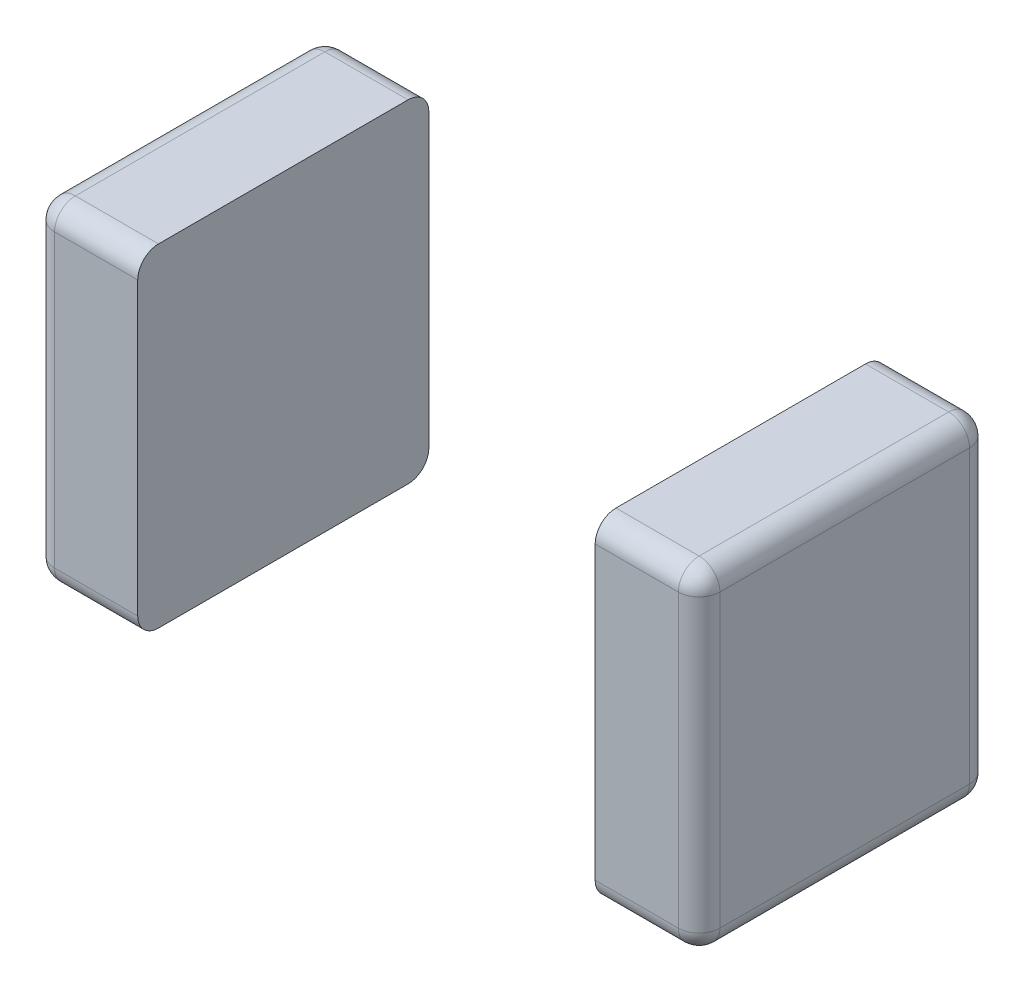
ISO-10303-21;
HEADER;
FILE_DESCRIPTION(('STEP AP214'),'2;1');
FILE_NAME('part.step','',(''),(''),'','','');
FILE_SCHEMA(('AUTOMOTIVE_DESIGN { 1 0 10303 214 1 1 1 1 }'));
ENDSEC;
DATA;
#1=APPLICATION_CONTEXT('core data for automotive mechanical design processes');
#2=APPLICATION_PROTOCOL_DEFINITION('international standard','automotive_design',2000,#1);
#3=PRODUCT_CONTEXT('',#1,'mechanical');
#4=PRODUCT('Part','Part','',(#3));
#5=PRODUCT_RELATED_PRODUCT_CATEGORY('part','',(#4));
#6=PRODUCT_DEFINITION_FORMATION('','',#4);
#7=PRODUCT_DEFINITION_CONTEXT('part definition',#1,'design');
#8=PRODUCT_DEFINITION('design','',#6,#7);
#9=PRODUCT_DEFINITION_SHAPE('','',#8);
#10=(LENGTH_UNIT() NAMED_UNIT(*) SI_UNIT(.MILLI.,.METRE.));
#11=(NAMED_UNIT(*) PLANE_ANGLE_UNIT() SI_UNIT($,.RADIAN.));
#12=(NAMED_UNIT(*) SI_UNIT($,.STERADIAN.) SOLID_ANGLE_UNIT());
#13=UNCERTAINTY_MEASURE_WITH_UNIT(LENGTH_MEASURE(1.E-05),#10,'distance_accuracy_value','');
#14=(GEOMETRIC_REPRESENTATION_CONTEXT(3) GLOBAL_UNCERTAINTY_ASSIGNED_CONTEXT((#13)) GLOBAL_UNIT_ASSIGNED_CONTEXT((#10,
#11,#12)) REPRESENTATION_CONTEXT('',''));
#15=CARTESIAN_POINT('',(0.,0.,0.));
#16=DIRECTION('',(0.,0.,1.));
#17=DIRECTION('',(1.,0.,0.));
#18=AXIS2_PLACEMENT_3D('',#15,#16,#17);
#19=CARTESIAN_POINT('',(1.6,-0.8,0.));
#20=DIRECTION('',(1.,0.,0.));
#21=DIRECTION('',(0.,1.,0.));
#22=AXIS2_PLACEMENT_3D('',#19,#20,#21);
#23=PLANE('',#22);
#24=DIRECTION('',(0.,1.,0.));
#25=VECTOR('',#24,1.);
#26=CARTESIAN_POINT('',(1.6,-0.4,1.3));
#27=LINE('',#26,#25);
#28=CARTESIAN_POINT('',(1.6,-0.7,1.3));
#29=VERTEX_POINT('',#28);
#30=CARTESIAN_POINT('',(1.6,0.7,1.3));
#31=VERTEX_POINT('',#30);
#32=EDGE_CURVE('P0_E204',#29,#31,#27,.T.);
#33=ORIENTED_EDGE('',*,*,#32,.F.);
#34=DIRECTION('',(0.,0.,1.));
#35=VECTOR('',#34,1.);
#36=CARTESIAN_POINT('',(1.6,-0.7,0.));
#37=LINE('',#36,#35);
#38=CARTESIAN_POINT('',(1.6,-0.7,0.1));
#39=VERTEX_POINT('',#38);
#40=EDGE_CURVE('P0_E27',#39,#29,#37,.T.);
#41=ORIENTED_EDGE('',*,*,#40,.F.);
#42=DIRECTION('',(0.,-1.,0.));
#43=VECTOR('',#42,1.);
#44=CARTESIAN_POINT('',(1.6,-0.4,0.1));
#45=LINE('',#44,#43);
#46=CARTESIAN_POINT('',(1.6,0.7,0.1));
#47=VERTEX_POINT('',#46);
#48=EDGE_CURVE('P0_E148',#47,#39,#45,.T.);
#49=ORIENTED_EDGE('',*,*,#48,.F.);
#50=DIRECTION('',(0.,0.,-1.));
#51=VECTOR('',#50,1.);
#52=CARTESIAN_POINT('',(1.6,0.7,0.));
#53=LINE('',#52,#51);
#54=EDGE_CURVE('P0_E166',#31,#47,#53,.T.);
#55=ORIENTED_EDGE('',*,*,#54,.F.);
#56=EDGE_LOOP('',(#33,#41,#49,#55));
#57=FACE_BOUND('',#56,.T.);
#58=ADVANCED_FACE('P0_F16',(#57),#23,.T.);
#59=CARTESIAN_POINT('',(1.5,-0.7,1.3));
#60=DIRECTION('',(-0.408248290463863,-0.816496580927726,-0.408248290463863));
#61=DIRECTION('',(0.577350269189626,-0.577350269189626,0.577350269189626));
#62=AXIS2_PLACEMENT_3D('',#59,#60,#61);
#63=SPHERICAL_SURFACE('',#62,0.1);
#64=CARTESIAN_POINT('',(1.5,-0.7,1.3));
#65=DIRECTION('',(0.,1.,0.));
#66=DIRECTION('',(0.,0.,1.));
#67=AXIS2_PLACEMENT_3D('',#64,#65,#66);
#68=CIRCLE('',#67,0.1);
#69=CARTESIAN_POINT('',(1.5,-0.7,1.4));
#70=VERTEX_POINT('',#69);
#71=EDGE_CURVE('P0_E209',#70,#29,#68,.T.);
#72=ORIENTED_EDGE('',*,*,#71,.F.);
#73=CARTESIAN_POINT('',(1.5,-0.7,1.3));
#74=DIRECTION('',(1.,0.,0.));
#75=DIRECTION('',(0.,-0.707106781186548,0.707106781186548));
#76=AXIS2_PLACEMENT_3D('',#73,#74,#75);
#77=CIRCLE('',#76,0.1);
#78=CARTESIAN_POINT('',(1.5,-0.8,1.3));
#79=VERTEX_POINT('',#78);
#80=EDGE_CURVE('P0_E158',#70,#79,#77,.T.);
#81=ORIENTED_EDGE('',*,*,#80,.T.);
#82=CARTESIAN_POINT('',(1.5,-0.7,1.3));
#83=DIRECTION('',(0.,0.,-1.));
#84=DIRECTION('',(1.,0.,0.));
#85=AXIS2_PLACEMENT_3D('',#82,#83,#84);
#86=CIRCLE('',#85,0.1);
#87=EDGE_CURVE('P0_E11',#29,#79,#86,.T.);
#88=ORIENTED_EDGE('',*,*,#87,.F.);
#89=EDGE_LOOP('',(#72,#81,#88));
#90=FACE_BOUND('',#89,.T.);
#91=ADVANCED_FACE('P0_F268',(#90),#63,.T.);
#92=CARTESIAN_POINT('',(1.5,-0.7,0.1));
#93=DIRECTION('',(-0.816496580927726,-0.408248290463863,-0.408248290463863));
#94=DIRECTION('',(0.577350269189626,-0.577350269189626,-0.577350269189626));
#95=AXIS2_PLACEMENT_3D('',#92,#93,#94);
#96=SPHERICAL_SURFACE('',#95,0.1);
#97=CARTESIAN_POINT('',(1.5,-0.7,0.1));
#98=DIRECTION('',(0.,0.,1.));
#99=DIRECTION('',(0.,-1.,0.));
#100=AXIS2_PLACEMENT_3D('',#97,#98,#99);
#101=CIRCLE('',#100,0.1);
#102=CARTESIAN_POINT('',(1.5,-0.8,0.1));
#103=VERTEX_POINT('',#102);
#104=EDGE_CURVE('P0_E152',#103,#39,#101,.T.);
#105=ORIENTED_EDGE('',*,*,#104,.F.);
#106=CARTESIAN_POINT('',(1.5,-0.7,0.1));
#107=DIRECTION('',(1.,0.,0.));
#108=DIRECTION('',(0.,-0.707106781186548,-0.707106781186548));
#109=AXIS2_PLACEMENT_3D('',#106,#107,#108);
#110=CIRCLE('',#109,0.1);
#111=CARTESIAN_POINT('',(1.5,-0.7,0.));
#112=VERTEX_POINT('',#111);
#113=EDGE_CURVE('P0_E143',#103,#112,#110,.T.);
#114=ORIENTED_EDGE('',*,*,#113,.T.);
#115=CARTESIAN_POINT('',(1.5,-0.7,0.1));
#116=DIRECTION('',(0.,1.,0.));
#117=DIRECTION('',(1.,0.,0.));
#118=AXIS2_PLACEMENT_3D('',#115,#116,#117);
#119=CIRCLE('',#118,0.1);
#120=EDGE_CURVE('P0_E168',#39,#112,#119,.T.);
#121=ORIENTED_EDGE('',*,*,#120,.F.);
#122=EDGE_LOOP('',(#105,#114,#121));
#123=FACE_BOUND('',#122,.T.);
#124=ADVANCED_FACE('P0_F327',(#123),#96,.T.);
#125=CARTESIAN_POINT('',(1.5,-0.7,0.));
#126=DIRECTION('',(0.,0.,1.));
#127=DIRECTION('',(0.707106781186548,-0.707106781186548,0.));
#128=AXIS2_PLACEMENT_3D('',#125,#126,#127);
#129=CYLINDRICAL_SURFACE('',#128,0.1);
#130=ORIENTED_EDGE('',*,*,#104,.T.);
#131=ORIENTED_EDGE('',*,*,#40,.T.);
#132=ORIENTED_EDGE('',*,*,#87,.T.);
#133=DIRECTION('',(0.,0.,-1.));
#134=VECTOR('',#133,1.);
#135=CARTESIAN_POINT('',(1.5,-0.8,0.));
#136=LINE('',#135,#134);
#137=EDGE_CURVE('P0_E196',#79,#103,#136,.T.);
#138=ORIENTED_EDGE('',*,*,#137,.T.);
#139=EDGE_LOOP('',(#130,#131,#132,#138));
#140=FACE_BOUND('',#139,.T.);
#141=ADVANCED_FACE('P0_F321',(#140),#129,.T.);
#142=CARTESIAN_POINT('',(1.5,0.7,0.1));
#143=DIRECTION('',(-0.816496580927726,0.408248290463863,-0.408248290463863));
#144=DIRECTION('',(0.577350269189626,0.577350269189626,-0.577350269189626));
#145=AXIS2_PLACEMENT_3D('',#142,#143,#144);
#146=SPHERICAL_SURFACE('',#145,0.1);
#147=CARTESIAN_POINT('',(1.5,0.7,0.1));
#148=DIRECTION('',(0.,-1.,0.));
#149=DIRECTION('',(0.,0.,-1.));
#150=AXIS2_PLACEMENT_3D('',#147,#148,#149);
#151=CIRCLE('',#150,0.1);
#152=CARTESIAN_POINT('',(1.5,0.7,0.));
#153=VERTEX_POINT('',#152);
#154=EDGE_CURVE('P0_E153',#153,#47,#151,.T.);
#155=ORIENTED_EDGE('',*,*,#154,.F.);
#156=CARTESIAN_POINT('',(1.5,0.7,0.1));
#157=DIRECTION('',(1.,0.,0.));
#158=DIRECTION('',(0.,0.707106781186548,-0.707106781186548));
#159=AXIS2_PLACEMENT_3D('',#156,#157,#158);
#160=CIRCLE('',#159,0.1);
#161=CARTESIAN_POINT('',(1.5,0.8,0.1));
#162=VERTEX_POINT('',#161);
#163=EDGE_CURVE('P0_E110',#153,#162,#160,.T.);
#164=ORIENTED_EDGE('',*,*,#163,.T.);
#165=CARTESIAN_POINT('',(1.5,0.7,0.1));
#166=DIRECTION('',(0.,0.,1.));
#167=DIRECTION('',(1.,0.,0.));
#168=AXIS2_PLACEMENT_3D('',#165,#166,#167);
#169=CIRCLE('',#168,0.1);
#170=EDGE_CURVE('P0_E167',#47,#162,#169,.T.);
#171=ORIENTED_EDGE('',*,*,#170,.F.);
#172=EDGE_LOOP('',(#155,#164,#171));
#173=FACE_BOUND('',#172,.T.);
#174=ADVANCED_FACE('P0_F326',(#173),#146,.T.);
#175=CARTESIAN_POINT('',(1.5,-0.4,0.1));
#176=DIRECTION('',(0.,1.,0.));
#177=DIRECTION('',(0.707106781186548,0.,-0.707106781186548));
#178=AXIS2_PLACEMENT_3D('',#175,#176,#177);
#179=CYLINDRICAL_SURFACE('',#178,0.1);
#180=ORIENTED_EDGE('',*,*,#120,.T.);
#181=DIRECTION('',(0.,1.,0.));
#182=VECTOR('',#181,1.);
#183=CARTESIAN_POINT('',(1.5,-0.4,0.));
#184=LINE('',#183,#182);
#185=EDGE_CURVE('P0_E147',#112,#153,#184,.T.);
#186=ORIENTED_EDGE('',*,*,#185,.T.);
#187=ORIENTED_EDGE('',*,*,#154,.T.);
#188=ORIENTED_EDGE('',*,*,#48,.T.);
#189=EDGE_LOOP('',(#180,#186,#187,#188));
#190=FACE_BOUND('',#189,.T.);
#191=ADVANCED_FACE('P0_F315',(#190),#179,.T.);
#192=CARTESIAN_POINT('',(1.5,0.7,1.3));
#193=DIRECTION('',(0.408248290463863,-0.816496580927726,0.408248290463863));
#194=DIRECTION('',(0.577350269189626,0.577350269189626,0.577350269189626));
#195=AXIS2_PLACEMENT_3D('',#192,#193,#194);
#196=SPHERICAL_SURFACE('',#195,0.1);
#197=CARTESIAN_POINT('',(1.5,0.7,1.3));
#198=DIRECTION('',(0.,0.,-1.));
#199=DIRECTION('',(0.,1.,0.));
#200=AXIS2_PLACEMENT_3D('',#197,#198,#199);
#201=CIRCLE('',#200,0.1);
#202=CARTESIAN_POINT('',(1.5,0.8,1.3));
#203=VERTEX_POINT('',#202);
#204=EDGE_CURVE('P0_E163',#203,#31,#201,.T.);
#205=ORIENTED_EDGE('',*,*,#204,.F.);
#206=CARTESIAN_POINT('',(1.5,0.7,1.3));
#207=DIRECTION('',(1.,0.,0.));
#208=DIRECTION('',(0.,0.707106781186548,0.707106781186548));
#209=AXIS2_PLACEMENT_3D('',#206,#207,#208);
#210=CIRCLE('',#209,0.1);
#211=CARTESIAN_POINT('',(1.5,0.7,1.4));
#212=VERTEX_POINT('',#211);
#213=EDGE_CURVE('P0_E142',#203,#212,#210,.T.);
#214=ORIENTED_EDGE('',*,*,#213,.T.);
#215=CARTESIAN_POINT('',(1.5,0.7,1.3));
#216=DIRECTION('',(0.,-1.,0.));
#217=DIRECTION('',(1.,0.,0.));
#218=AXIS2_PLACEMENT_3D('',#215,#216,#217);
#219=CIRCLE('',#218,0.1);
#220=EDGE_CURVE('P0_E208',#31,#212,#219,.T.);
#221=ORIENTED_EDGE('',*,*,#220,.F.);
#222=EDGE_LOOP('',(#205,#214,#221));
#223=FACE_BOUND('',#222,.T.);
#224=ADVANCED_FACE('P0_F296',(#223),#196,.T.);
#225=CARTESIAN_POINT('',(1.5,0.7,0.));
#226=DIRECTION('',(0.,0.,1.));
#227=DIRECTION('',(0.707106781186548,0.707106781186548,0.));
#228=AXIS2_PLACEMENT_3D('',#225,#226,#227);
#229=CYLINDRICAL_SURFACE('',#228,0.1);
#230=ORIENTED_EDGE('',*,*,#170,.T.);
#231=DIRECTION('',(0.,0.,1.));
#232=VECTOR('',#231,1.);
#233=CARTESIAN_POINT('',(1.5,0.8,0.));
#234=LINE('',#233,#232);
#235=EDGE_CURVE('P0_E192',#162,#203,#234,.T.);
#236=ORIENTED_EDGE('',*,*,#235,.T.);
#237=ORIENTED_EDGE('',*,*,#204,.T.);
#238=ORIENTED_EDGE('',*,*,#54,.T.);
#239=EDGE_LOOP('',(#230,#236,#237,#238));
#240=FACE_BOUND('',#239,.T.);
#241=ADVANCED_FACE('P0_F291',(#240),#229,.T.);
#242=CARTESIAN_POINT('',(1.5,-0.4,1.3));
#243=DIRECTION('',(0.,1.,0.));
#244=DIRECTION('',(0.707106781186548,0.,0.707106781186548));
#245=AXIS2_PLACEMENT_3D('',#242,#243,#244);
#246=CYLINDRICAL_SURFACE('',#245,0.1);
#247=ORIENTED_EDGE('',*,*,#71,.T.);
#248=ORIENTED_EDGE('',*,*,#32,.T.);
#249=ORIENTED_EDGE('',*,*,#220,.T.);
#250=DIRECTION('',(0.,-1.,0.));
#251=VECTOR('',#250,1.);
#252=CARTESIAN_POINT('',(1.5,-0.4,1.4));
#253=LINE('',#252,#251);
#254=EDGE_CURVE('P0_E159',#212,#70,#253,.T.);
#255=ORIENTED_EDGE('',*,*,#254,.T.);
#256=EDGE_LOOP('',(#247,#248,#249,#255));
#257=FACE_BOUND('',#256,.T.);
#258=ADVANCED_FACE('P0_F256',(#257),#246,.T.);
#259=CARTESIAN_POINT('',(0.,0.,0.));
#260=DIRECTION('',(0.,0.,1.));
#261=DIRECTION('',(1.,0.,0.));
#262=AXIS2_PLACEMENT_3D('',#259,#260,#261);
#263=PLANE('',#262);
#264=DIRECTION('',(0.,1.,0.));
#265=VECTOR('',#264,1.);
#266=CARTESIAN_POINT('',(1.1,-0.754575038837,0.));
#267=LINE('',#266,#265);
#268=CARTESIAN_POINT('',(1.1,-0.7,0.));
#269=VERTEX_POINT('',#268);
#270=CARTESIAN_POINT('',(1.1,0.7,0.));
#271=VERTEX_POINT('',#270);
#272=EDGE_CURVE('P0_E115',#269,#271,#267,.T.);
#273=ORIENTED_EDGE('',*,*,#272,.T.);
#274=DIRECTION('',(-1.,0.,0.));
#275=VECTOR('',#274,1.);
#276=CARTESIAN_POINT('',(0.8,0.7,0.));
#277=LINE('',#276,#275);
#278=EDGE_CURVE('P0_E103',#153,#271,#277,.T.);
#279=ORIENTED_EDGE('',*,*,#278,.F.);
#280=ORIENTED_EDGE('',*,*,#185,.F.);
#281=DIRECTION('',(1.,0.,0.));
#282=VECTOR('',#281,1.);
#283=CARTESIAN_POINT('',(-0.8,-0.7,0.));
#284=LINE('',#283,#282);
#285=EDGE_CURVE('P0_E91',#269,#112,#284,.T.);
#286=ORIENTED_EDGE('',*,*,#285,.F.);
#287=EDGE_LOOP('',(#273,#279,#280,#286));
#288=FACE_BOUND('',#287,.T.);
#289=ADVANCED_FACE('P0_F116',(#288),#263,.F.);
#290=CARTESIAN_POINT('',(-0.8,-0.7,0.1));
#291=DIRECTION('',(1.,0.,0.));
#292=DIRECTION('',(0.,-0.707106781186548,-0.707106781186548));
#293=AXIS2_PLACEMENT_3D('',#290,#291,#292);
#294=CYLINDRICAL_SURFACE('',#293,0.1);
#295=CARTESIAN_POINT('',(1.1,-0.7,0.1));
#296=DIRECTION('',(1.,0.,0.));
#297=DIRECTION('',(0.,-0.707106781186548,-0.707106781186548));
#298=AXIS2_PLACEMENT_3D('',#295,#296,#297);
#299=CIRCLE('',#298,0.1);
#300=CARTESIAN_POINT('',(1.1,-0.8,0.1));
#301=VERTEX_POINT('',#300);
#302=EDGE_CURVE('P0_E120',#301,#269,#299,.T.);
#303=ORIENTED_EDGE('',*,*,#302,.T.);
#304=ORIENTED_EDGE('',*,*,#285,.T.);
#305=ORIENTED_EDGE('',*,*,#113,.F.);
#306=DIRECTION('',(-1.,0.,0.));
#307=VECTOR('',#306,1.);
#308=CARTESIAN_POINT('',(-0.8,-0.8,0.1));
#309=LINE('',#308,#307);
#310=EDGE_CURVE('P0_E201',#103,#301,#309,.T.);
#311=ORIENTED_EDGE('',*,*,#310,.T.);
#312=EDGE_LOOP('',(#303,#304,#305,#311));
#313=FACE_BOUND('',#312,.T.);
#314=ADVANCED_FACE('P0_F337',(#313),#294,.T.);
#315=CARTESIAN_POINT('',(-1.6,-0.8,0.));
#316=DIRECTION('',(0.,-1.,0.));
#317=DIRECTION('',(0.,0.,-1.));
#318=AXIS2_PLACEMENT_3D('',#315,#316,#317);
#319=PLANE('',#318);
#320=DIRECTION('',(0.,0.,-1.));
#321=VECTOR('',#320,1.);
#322=CARTESIAN_POINT('',(1.1,-0.8,0.7));
#323=LINE('',#322,#321);
#324=CARTESIAN_POINT('',(1.1,-0.8,1.3));
#325=VERTEX_POINT('',#324);
#326=EDGE_CURVE('P0_E193',#325,#301,#323,.T.);
#327=ORIENTED_EDGE('',*,*,#326,.T.);
#328=ORIENTED_EDGE('',*,*,#310,.F.);
#329=ORIENTED_EDGE('',*,*,#137,.F.);
#330=DIRECTION('',(1.,0.,0.));
#331=VECTOR('',#330,1.);
#332=CARTESIAN_POINT('',(-0.8,-0.8,1.3));
#333=LINE('',#332,#331);
#334=EDGE_CURVE('P0_E154',#325,#79,#333,.T.);
#335=ORIENTED_EDGE('',*,*,#334,.F.);
#336=EDGE_LOOP('',(#327,#328,#329,#335));
#337=FACE_BOUND('',#336,.T.);
#338=ADVANCED_FACE('P0_F18',(#337),#319,.T.);
#339=CARTESIAN_POINT('',(-0.8,-0.7,1.3));
#340=DIRECTION('',(1.,0.,0.));
#341=DIRECTION('',(0.,-0.707106781186548,0.707106781186548));
#342=AXIS2_PLACEMENT_3D('',#339,#340,#341);
#343=CYLINDRICAL_SURFACE('',#342,0.1);
#344=CARTESIAN_POINT('',(1.1,-0.7,1.3));
#345=DIRECTION('',(1.,0.,0.));
#346=DIRECTION('',(0.,-0.707106781186548,0.707106781186548));
#347=AXIS2_PLACEMENT_3D('',#344,#345,#346);
#348=CIRCLE('',#347,0.1);
#349=CARTESIAN_POINT('',(1.1,-0.7,1.4));
#350=VERTEX_POINT('',#349);
#351=EDGE_CURVE('P0_E20',#350,#325,#348,.T.);
#352=ORIENTED_EDGE('',*,*,#351,.T.);
#353=ORIENTED_EDGE('',*,*,#334,.T.);
#354=ORIENTED_EDGE('',*,*,#80,.F.);
#355=DIRECTION('',(-1.,0.,0.));
#356=VECTOR('',#355,1.);
#357=CARTESIAN_POINT('',(-0.8,-0.7,1.4));
#358=LINE('',#357,#356);
#359=EDGE_CURVE('P0_E160',#70,#350,#358,.T.);
#360=ORIENTED_EDGE('',*,*,#359,.T.);
#361=EDGE_LOOP('',(#352,#353,#354,#360));
#362=FACE_BOUND('',#361,.T.);
#363=ADVANCED_FACE('P0_F265',(#362),#343,.T.);
#364=CARTESIAN_POINT('',(0.,0.,1.4));
#365=DIRECTION('',(0.,0.,1.));
#366=DIRECTION('',(1.,0.,0.));
#367=AXIS2_PLACEMENT_3D('',#364,#365,#366);
#368=PLANE('',#367);
#369=DIRECTION('',(0.,-1.,0.));
#370=VECTOR('',#369,1.);
#371=CARTESIAN_POINT('',(1.1,-0.754575038837,1.4));
#372=LINE('',#371,#370);
#373=CARTESIAN_POINT('',(1.1,0.7,1.4));
#374=VERTEX_POINT('',#373);
#375=EDGE_CURVE('P0_E137',#374,#350,#372,.T.);
#376=ORIENTED_EDGE('',*,*,#375,.T.);
#377=ORIENTED_EDGE('',*,*,#359,.F.);
#378=ORIENTED_EDGE('',*,*,#254,.F.);
#379=DIRECTION('',(1.,0.,0.));
#380=VECTOR('',#379,1.);
#381=CARTESIAN_POINT('',(0.8,0.7,1.4));
#382=LINE('',#381,#380);
#383=EDGE_CURVE('P0_E112',#374,#212,#382,.T.);
#384=ORIENTED_EDGE('',*,*,#383,.F.);
#385=EDGE_LOOP('',(#376,#377,#378,#384));
#386=FACE_BOUND('',#385,.T.);
#387=ADVANCED_FACE('P0_F260',(#386),#368,.T.);
#388=CARTESIAN_POINT('',(0.8,0.7,1.3));
#389=DIRECTION('',(-1.,0.,0.));
#390=DIRECTION('',(0.,0.707106781186548,0.707106781186548));
#391=AXIS2_PLACEMENT_3D('',#388,#389,#390);
#392=CYLINDRICAL_SURFACE('',#391,0.1);
#393=CARTESIAN_POINT('',(1.1,0.7,1.3));
#394=DIRECTION('',(1.,0.,0.));
#395=DIRECTION('',(0.,0.707106781186548,0.707106781186548));
#396=AXIS2_PLACEMENT_3D('',#393,#394,#395);
#397=CIRCLE('',#396,0.1);
#398=CARTESIAN_POINT('',(1.1,0.8,1.3));
#399=VERTEX_POINT('',#398);
#400=EDGE_CURVE('P0_E133',#399,#374,#397,.T.);
#401=ORIENTED_EDGE('',*,*,#400,.T.);
#402=ORIENTED_EDGE('',*,*,#383,.T.);
#403=ORIENTED_EDGE('',*,*,#213,.F.);
#404=DIRECTION('',(-1.,0.,0.));
#405=VECTOR('',#404,1.);
#406=CARTESIAN_POINT('',(0.8,0.8,1.3));
#407=LINE('',#406,#405);
#408=EDGE_CURVE('P0_E189',#203,#399,#407,.T.);
#409=ORIENTED_EDGE('',*,*,#408,.T.);
#410=EDGE_LOOP('',(#401,#402,#403,#409));
#411=FACE_BOUND('',#410,.T.);
#412=ADVANCED_FACE('P0_F298',(#411),#392,.T.);
#413=CARTESIAN_POINT('',(0.8,0.7,0.1));
#414=DIRECTION('',(-1.,0.,0.));
#415=DIRECTION('',(0.,0.707106781186548,-0.707106781186548));
#416=AXIS2_PLACEMENT_3D('',#413,#414,#415);
#417=CYLINDRICAL_SURFACE('',#416,0.1);
#418=CARTESIAN_POINT('',(1.1,0.7,0.1));
#419=DIRECTION('',(1.,0.,0.));
#420=DIRECTION('',(0.,0.707106781186548,-0.707106781186548));
#421=AXIS2_PLACEMENT_3D('',#418,#419,#420);
#422=CIRCLE('',#421,0.1);
#423=CARTESIAN_POINT('',(1.1,0.8,0.1));
#424=VERTEX_POINT('',#423);
#425=EDGE_CURVE('P0_E107',#271,#424,#422,.T.);
#426=ORIENTED_EDGE('',*,*,#425,.T.);
#427=DIRECTION('',(1.,0.,0.));
#428=VECTOR('',#427,1.);
#429=CARTESIAN_POINT('',(0.8,0.8,0.1));
#430=LINE('',#429,#428);
#431=EDGE_CURVE('P0_E200',#424,#162,#430,.T.);
#432=ORIENTED_EDGE('',*,*,#431,.T.);
#433=ORIENTED_EDGE('',*,*,#163,.F.);
#434=ORIENTED_EDGE('',*,*,#278,.T.);
#435=EDGE_LOOP('',(#426,#432,#433,#434));
#436=FACE_BOUND('',#435,.T.);
#437=ADVANCED_FACE('P0_F104',(#436),#417,.T.);
#438=CARTESIAN_POINT('',(1.6,0.8,0.));
#439=DIRECTION('',(0.,1.,0.));
#440=DIRECTION('',(1.,0.,0.));
#441=AXIS2_PLACEMENT_3D('',#438,#439,#440);
#442=PLANE('',#441);
#443=DIRECTION('',(0.,0.,1.));
#444=VECTOR('',#443,1.);
#445=CARTESIAN_POINT('',(1.1,0.8,0.7));
#446=LINE('',#445,#444);
#447=EDGE_CURVE('P0_E126',#424,#399,#446,.T.);
#448=ORIENTED_EDGE('',*,*,#447,.T.);
#449=ORIENTED_EDGE('',*,*,#408,.F.);
#450=ORIENTED_EDGE('',*,*,#235,.F.);
#451=ORIENTED_EDGE('',*,*,#431,.F.);
#452=EDGE_LOOP('',(#448,#449,#450,#451));
#453=FACE_BOUND('',#452,.T.);
#454=ADVANCED_FACE('P0_F390',(#453),#442,.T.);
#455=CARTESIAN_POINT('',(1.1,-1.509150077673,1.4));
#456=DIRECTION('',(1.,0.,0.));
#457=DIRECTION('',(0.,1.,0.));
#458=AXIS2_PLACEMENT_3D('',#455,#456,#457);
#459=PLANE('',#458);
#460=ORIENTED_EDGE('',*,*,#351,.F.);
#461=ORIENTED_EDGE('',*,*,#375,.F.);
#462=ORIENTED_EDGE('',*,*,#400,.F.);
#463=ORIENTED_EDGE('',*,*,#447,.F.);
#464=ORIENTED_EDGE('',*,*,#425,.F.);
#465=ORIENTED_EDGE('',*,*,#272,.F.);
#466=ORIENTED_EDGE('',*,*,#302,.F.);
#467=ORIENTED_EDGE('',*,*,#326,.F.);
#468=EDGE_LOOP('',(#460,#461,#462,#463,#464,#465,#466,#467));
#469=FACE_BOUND('',#468,.T.);
#470=ADVANCED_FACE('P0_F123',(#469),#459,.F.);
#471=CLOSED_SHELL('',(#58,#91,#124,#141,#174,#191,#224,#241,#258,#289,#314,#338,#363,#387,#412,
#437,#454,#470));
#472=MANIFOLD_SOLID_BREP('P0_B1',#471);
#473=CARTESIAN_POINT('',(-1.1,1.509150077673,1.4));
#474=DIRECTION('',(-1.,0.,0.));
#475=DIRECTION('',(0.,0.,1.));
#476=AXIS2_PLACEMENT_3D('',#473,#474,#475);
#477=PLANE('',#476);
#478=CARTESIAN_POINT('',(-1.1,-0.7,1.3));
#479=DIRECTION('',(-1.,0.,0.));
#480=DIRECTION('',(0.,-0.707106781186548,0.707106781186548));
#481=AXIS2_PLACEMENT_3D('',#478,#479,#480);
#482=CIRCLE('',#481,0.1);
#483=CARTESIAN_POINT('',(-1.1,-0.8,1.3));
#484=VERTEX_POINT('',#483);
#485=CARTESIAN_POINT('',(-1.1,-0.7,1.4));
#486=VERTEX_POINT('',#485);
#487=EDGE_CURVE('P1_E169',#484,#486,#482,.T.);
#488=ORIENTED_EDGE('',*,*,#487,.F.);
#489=DIRECTION('',(0.,0.,1.));
#490=VECTOR('',#489,1.);
#491=CARTESIAN_POINT('',(-1.1,-0.8,0.7));
#492=LINE('',#491,#490);
#493=CARTESIAN_POINT('',(-1.1,-0.8,0.1));
#494=VERTEX_POINT('',#493);
#495=EDGE_CURVE('P1_E173',#494,#484,#492,.T.);
#496=ORIENTED_EDGE('',*,*,#495,.F.);
#497=CARTESIAN_POINT('',(-1.1,-0.7,0.1));
#498=DIRECTION('',(-1.,0.,0.));
#499=DIRECTION('',(0.,-0.707106781186548,-0.707106781186548));
#500=AXIS2_PLACEMENT_3D('',#497,#498,#499);
#501=CIRCLE('',#500,0.1);
#502=CARTESIAN_POINT('',(-1.1,-0.7,0.));
#503=VERTEX_POINT('',#502);
#504=EDGE_CURVE('P1_E129',#503,#494,#501,.T.);
#505=ORIENTED_EDGE('',*,*,#504,.F.);
#506=DIRECTION('',(0.,-1.,0.));
#507=VECTOR('',#506,1.);
#508=CARTESIAN_POINT('',(-1.1,0.754575038837,0.));
#509=LINE('',#508,#507);
#510=CARTESIAN_POINT('',(-1.1,0.7,0.));
#511=VERTEX_POINT('',#510);
#512=EDGE_CURVE('P1_E115',#511,#503,#509,.T.);
#513=ORIENTED_EDGE('',*,*,#512,.F.);
#514=CARTESIAN_POINT('',(-1.1,0.7,0.1));
#515=DIRECTION('',(-1.,0.,0.));
#516=DIRECTION('',(0.,0.707106781186548,-0.707106781186548));
#517=AXIS2_PLACEMENT_3D('',#514,#515,#516);
#518=CIRCLE('',#517,0.1);
#519=CARTESIAN_POINT('',(-1.1,0.8,0.1));
#520=VERTEX_POINT('',#519);
#521=EDGE_CURVE('P1_E105',#520,#511,#518,.T.);
#522=ORIENTED_EDGE('',*,*,#521,.F.);
#523=DIRECTION('',(0.,0.,-1.));
#524=VECTOR('',#523,1.);
#525=CARTESIAN_POINT('',(-1.1,0.8,0.7));
#526=LINE('',#525,#524);
#527=CARTESIAN_POINT('',(-1.1,0.8,1.3));
#528=VERTEX_POINT('',#527);
#529=EDGE_CURVE('P1_E11',#528,#520,#526,.T.);
#530=ORIENTED_EDGE('',*,*,#529,.F.);
#531=CARTESIAN_POINT('',(-1.1,0.7,1.3));
#532=DIRECTION('',(-1.,0.,0.));
#533=DIRECTION('',(0.,0.707106781186548,0.707106781186548));
#534=AXIS2_PLACEMENT_3D('',#531,#532,#533);
#535=CIRCLE('',#534,0.1);
#536=CARTESIAN_POINT('',(-1.1,0.7,1.4));
#537=VERTEX_POINT('',#536);
#538=EDGE_CURVE('P1_E102',#537,#528,#535,.T.);
#539=ORIENTED_EDGE('',*,*,#538,.F.);
#540=DIRECTION('',(0.,1.,0.));
#541=VECTOR('',#540,1.);
#542=CARTESIAN_POINT('',(-1.1,0.754575038837,1.4));
#543=LINE('',#542,#541);
#544=EDGE_CURVE('P1_E194',#486,#537,#543,.T.);
#545=ORIENTED_EDGE('',*,*,#544,.F.);
#546=EDGE_LOOP('',(#488,#496,#505,#513,#522,#530,#539,#545));
#547=FACE_BOUND('',#546,.T.);
#548=ADVANCED_FACE('P1_F16',(#547),#477,.F.);
#549=CARTESIAN_POINT('',(1.6,0.8,0.));
#550=DIRECTION('',(0.,1.,0.));
#551=DIRECTION('',(1.,0.,0.));
#552=AXIS2_PLACEMENT_3D('',#549,#550,#551);
#553=PLANE('',#552);
#554=ORIENTED_EDGE('',*,*,#529,.T.);
#555=DIRECTION('',(1.,0.,0.));
#556=VECTOR('',#555,1.);
#557=CARTESIAN_POINT('',(0.8,0.8,0.1));
#558=LINE('',#557,#556);
#559=CARTESIAN_POINT('',(-1.5,0.8,0.1));
#560=VERTEX_POINT('',#559);
#561=EDGE_CURVE('P1_E27',#560,#520,#558,.T.);
#562=ORIENTED_EDGE('',*,*,#561,.F.);
#563=DIRECTION('',(0.,0.,-1.));
#564=VECTOR('',#563,1.);
#565=CARTESIAN_POINT('',(-1.5,0.8,0.));
#566=LINE('',#565,#564);
#567=CARTESIAN_POINT('',(-1.5,0.8,1.3));
#568=VERTEX_POINT('',#567);
#569=EDGE_CURVE('P1_E110',#568,#560,#566,.T.);
#570=ORIENTED_EDGE('',*,*,#569,.F.);
#571=DIRECTION('',(-1.,0.,0.));
#572=VECTOR('',#571,1.);
#573=CARTESIAN_POINT('',(0.8,0.8,1.3));
#574=LINE('',#573,#572);
#575=EDGE_CURVE('P1_E107',#528,#568,#574,.T.);
#576=ORIENTED_EDGE('',*,*,#575,.F.);
#577=EDGE_LOOP('',(#554,#562,#570,#576));
#578=FACE_BOUND('',#577,.T.);
#579=ADVANCED_FACE('P1_F108',(#578),#553,.T.);
#580=CARTESIAN_POINT('',(0.8,0.7,0.1));
#581=DIRECTION('',(-1.,0.,0.));
#582=DIRECTION('',(0.,0.707106781186548,-0.707106781186548));
#583=AXIS2_PLACEMENT_3D('',#580,#581,#582);
#584=CYLINDRICAL_SURFACE('',#583,0.1);
#585=ORIENTED_EDGE('',*,*,#521,.T.);
#586=DIRECTION('',(-1.,0.,0.));
#587=VECTOR('',#586,1.);
#588=CARTESIAN_POINT('',(0.8,0.7,0.));
#589=LINE('',#588,#587);
#590=CARTESIAN_POINT('',(-1.5,0.7,0.));
#591=VERTEX_POINT('',#590);
#592=EDGE_CURVE('P1_E158',#511,#591,#589,.T.);
#593=ORIENTED_EDGE('',*,*,#592,.T.);
#594=CARTESIAN_POINT('',(-1.5,0.7,0.1));
#595=DIRECTION('',(-1.,0.,0.));
#596=DIRECTION('',(0.,0.707106781186548,-0.707106781186548));
#597=AXIS2_PLACEMENT_3D('',#594,#595,#596);
#598=CIRCLE('',#597,0.1);
#599=EDGE_CURVE('P1_E156',#560,#591,#598,.T.);
#600=ORIENTED_EDGE('',*,*,#599,.F.);
#601=ORIENTED_EDGE('',*,*,#561,.T.);
#602=EDGE_LOOP('',(#585,#593,#600,#601));
#603=FACE_BOUND('',#602,.T.);
#604=ADVANCED_FACE('P1_F295',(#603),#584,.T.);
#605=CARTESIAN_POINT('',(0.,0.,0.));
#606=DIRECTION('',(0.,0.,1.));
#607=DIRECTION('',(1.,0.,0.));
#608=AXIS2_PLACEMENT_3D('',#605,#606,#607);
#609=PLANE('',#608);
#610=ORIENTED_EDGE('',*,*,#512,.T.);
#611=DIRECTION('',(1.,0.,0.));
#612=VECTOR('',#611,1.);
#613=CARTESIAN_POINT('',(-0.8,-0.7,0.));
#614=LINE('',#613,#612);
#615=CARTESIAN_POINT('',(-1.5,-0.7,0.));
#616=VERTEX_POINT('',#615);
#617=EDGE_CURVE('P1_E122',#616,#503,#614,.T.);
#618=ORIENTED_EDGE('',*,*,#617,.F.);
#619=DIRECTION('',(0.,-1.,0.));
#620=VECTOR('',#619,1.);
#621=CARTESIAN_POINT('',(-1.5,0.4,0.));
#622=LINE('',#621,#620);
#623=EDGE_CURVE('P1_E146',#591,#616,#622,.T.);
#624=ORIENTED_EDGE('',*,*,#623,.F.);
#625=ORIENTED_EDGE('',*,*,#592,.F.);
#626=EDGE_LOOP('',(#610,#618,#624,#625));
#627=FACE_BOUND('',#626,.T.);
#628=ADVANCED_FACE('P1_F291',(#627),#609,.F.);
#629=CARTESIAN_POINT('',(0.8,0.7,1.3));
#630=DIRECTION('',(-1.,0.,0.));
#631=DIRECTION('',(0.,0.707106781186548,0.707106781186548));
#632=AXIS2_PLACEMENT_3D('',#629,#630,#631);
#633=CYLINDRICAL_SURFACE('',#632,0.1);
#634=ORIENTED_EDGE('',*,*,#538,.T.);
#635=ORIENTED_EDGE('',*,*,#575,.T.);
#636=CARTESIAN_POINT('',(-1.5,0.7,1.3));
#637=DIRECTION('',(-1.,0.,0.));
#638=DIRECTION('',(0.,0.707106781186548,0.707106781186548));
#639=AXIS2_PLACEMENT_3D('',#636,#637,#638);
#640=CIRCLE('',#639,0.1);
#641=CARTESIAN_POINT('',(-1.5,0.7,1.4));
#642=VERTEX_POINT('',#641);
#643=EDGE_CURVE('P1_E132',#642,#568,#640,.T.);
#644=ORIENTED_EDGE('',*,*,#643,.F.);
#645=DIRECTION('',(1.,0.,0.));
#646=VECTOR('',#645,1.);
#647=CARTESIAN_POINT('',(0.8,0.7,1.4));
#648=LINE('',#647,#646);
#649=EDGE_CURVE('P1_E119',#642,#537,#648,.T.);
#650=ORIENTED_EDGE('',*,*,#649,.T.);
#651=EDGE_LOOP('',(#634,#635,#644,#650));
#652=FACE_BOUND('',#651,.T.);
#653=ADVANCED_FACE('P1_F117',(#652),#633,.T.);
#654=CARTESIAN_POINT('',(-0.8,-0.7,0.1));
#655=DIRECTION('',(1.,0.,0.));
#656=DIRECTION('',(0.,-0.707106781186548,-0.707106781186548));
#657=AXIS2_PLACEMENT_3D('',#654,#655,#656);
#658=CYLINDRICAL_SURFACE('',#657,0.1);
#659=ORIENTED_EDGE('',*,*,#504,.T.);
#660=DIRECTION('',(-1.,0.,0.));
#661=VECTOR('',#660,1.);
#662=CARTESIAN_POINT('',(-0.8,-0.8,0.1));
#663=LINE('',#662,#661);
#664=CARTESIAN_POINT('',(-1.5,-0.8,0.1));
#665=VERTEX_POINT('',#664);
#666=EDGE_CURVE('P1_E20',#494,#665,#663,.T.);
#667=ORIENTED_EDGE('',*,*,#666,.T.);
#668=CARTESIAN_POINT('',(-1.5,-0.7,0.1));
#669=DIRECTION('',(-1.,0.,0.));
#670=DIRECTION('',(0.,-0.707106781186548,-0.707106781186548));
#671=AXIS2_PLACEMENT_3D('',#668,#669,#670);
#672=CIRCLE('',#671,0.1);
#673=EDGE_CURVE('P1_E150',#616,#665,#672,.T.);
#674=ORIENTED_EDGE('',*,*,#673,.F.);
#675=ORIENTED_EDGE('',*,*,#617,.T.);
#676=EDGE_LOOP('',(#659,#667,#674,#675));
#677=FACE_BOUND('',#676,.T.);
#678=ADVANCED_FACE('P1_F265',(#677),#658,.T.);
#679=CARTESIAN_POINT('',(0.,0.,1.4));
#680=DIRECTION('',(0.,0.,1.));
#681=DIRECTION('',(1.,0.,0.));
#682=AXIS2_PLACEMENT_3D('',#679,#680,#681);
#683=PLANE('',#682);
#684=ORIENTED_EDGE('',*,*,#544,.T.);
#685=ORIENTED_EDGE('',*,*,#649,.F.);
#686=DIRECTION('',(0.,1.,0.));
#687=VECTOR('',#686,1.);
#688=CARTESIAN_POINT('',(-1.5,0.4,1.4));
#689=LINE('',#688,#687);
#690=CARTESIAN_POINT('',(-1.5,-0.7,1.4));
#691=VERTEX_POINT('',#690);
#692=EDGE_CURVE('P1_E170',#691,#642,#689,.T.);
#693=ORIENTED_EDGE('',*,*,#692,.F.);
#694=DIRECTION('',(-1.,0.,0.));
#695=VECTOR('',#694,1.);
#696=CARTESIAN_POINT('',(-0.8,-0.7,1.4));
#697=LINE('',#696,#695);
#698=EDGE_CURVE('P1_E203',#486,#691,#697,.T.);
#699=ORIENTED_EDGE('',*,*,#698,.F.);
#700=EDGE_LOOP('',(#684,#685,#693,#699));
#701=FACE_BOUND('',#700,.T.);
#702=ADVANCED_FACE('P1_F273',(#701),#683,.T.);
#703=CARTESIAN_POINT('',(-1.6,-0.8,0.));
#704=DIRECTION('',(0.,-1.,0.));
#705=DIRECTION('',(0.,0.,-1.));
#706=AXIS2_PLACEMENT_3D('',#703,#704,#705);
#707=PLANE('',#706);
#708=ORIENTED_EDGE('',*,*,#495,.T.);
#709=DIRECTION('',(1.,0.,0.));
#710=VECTOR('',#709,1.);
#711=CARTESIAN_POINT('',(-0.8,-0.8,1.3));
#712=LINE('',#711,#710);
#713=CARTESIAN_POINT('',(-1.5,-0.8,1.3));
#714=VERTEX_POINT('',#713);
#715=EDGE_CURVE('P1_E177',#714,#484,#712,.T.);
#716=ORIENTED_EDGE('',*,*,#715,.F.);
#717=DIRECTION('',(0.,0.,1.));
#718=VECTOR('',#717,1.);
#719=CARTESIAN_POINT('',(-1.5,-0.8,0.));
#720=LINE('',#719,#718);
#721=EDGE_CURVE('P1_E137',#665,#714,#720,.T.);
#722=ORIENTED_EDGE('',*,*,#721,.F.);
#723=ORIENTED_EDGE('',*,*,#666,.F.);
#724=EDGE_LOOP('',(#708,#716,#722,#723));
#725=FACE_BOUND('',#724,.T.);
#726=ADVANCED_FACE('P1_F267',(#725),#707,.T.);
#727=CARTESIAN_POINT('',(-0.8,-0.7,1.3));
#728=DIRECTION('',(1.,0.,0.));
#729=DIRECTION('',(0.,-0.707106781186548,0.707106781186548));
#730=AXIS2_PLACEMENT_3D('',#727,#728,#729);
#731=CYLINDRICAL_SURFACE('',#730,0.1);
#732=ORIENTED_EDGE('',*,*,#487,.T.);
#733=ORIENTED_EDGE('',*,*,#698,.T.);
#734=CARTESIAN_POINT('',(-1.5,-0.7,1.3));
#735=DIRECTION('',(-1.,0.,0.));
#736=DIRECTION('',(0.,-0.707106781186548,0.707106781186548));
#737=AXIS2_PLACEMENT_3D('',#734,#735,#736);
#738=CIRCLE('',#737,0.1);
#739=EDGE_CURVE('P1_E145',#714,#691,#738,.T.);
#740=ORIENTED_EDGE('',*,*,#739,.F.);
#741=ORIENTED_EDGE('',*,*,#715,.T.);
#742=EDGE_LOOP('',(#732,#733,#740,#741));
#743=FACE_BOUND('',#742,.T.);
#744=ADVANCED_FACE('P1_F231',(#743),#731,.T.);
#745=CARTESIAN_POINT('',(-1.5,0.7,0.));
#746=DIRECTION('',(0.,0.,1.));
#747=DIRECTION('',(-0.707106781186548,0.707106781186548,0.));
#748=AXIS2_PLACEMENT_3D('',#745,#746,#747);
#749=CYLINDRICAL_SURFACE('',#748,0.1);
#750=CARTESIAN_POINT('',(-1.5,0.7,0.1));
#751=DIRECTION('',(0.,0.,1.));
#752=DIRECTION('',(0.,1.,0.));
#753=AXIS2_PLACEMENT_3D('',#750,#751,#752);
#754=CIRCLE('',#753,0.1);
#755=CARTESIAN_POINT('',(-1.6,0.7,0.1));
#756=VERTEX_POINT('',#755);
#757=EDGE_CURVE('P1_E152',#560,#756,#754,.T.);
#758=ORIENTED_EDGE('',*,*,#757,.T.);
#759=DIRECTION('',(0.,0.,1.));
#760=VECTOR('',#759,1.);
#761=CARTESIAN_POINT('',(-1.6,0.7,0.));
#762=LINE('',#761,#760);
#763=CARTESIAN_POINT('',(-1.6,0.7,1.3));
#764=VERTEX_POINT('',#763);
#765=EDGE_CURVE('P1_E199',#756,#764,#762,.T.);
#766=ORIENTED_EDGE('',*,*,#765,.T.);
#767=CARTESIAN_POINT('',(-1.5,0.7,1.3));
#768=DIRECTION('',(0.,0.,-1.));
#769=DIRECTION('',(-1.,0.,0.));
#770=AXIS2_PLACEMENT_3D('',#767,#768,#769);
#771=CIRCLE('',#770,0.1);
#772=EDGE_CURVE('P1_E188',#764,#568,#771,.T.);
#773=ORIENTED_EDGE('',*,*,#772,.T.);
#774=ORIENTED_EDGE('',*,*,#569,.T.);
#775=EDGE_LOOP('',(#758,#766,#773,#774));
#776=FACE_BOUND('',#775,.T.);
#777=ADVANCED_FACE('P1_F308',(#776),#749,.T.);
#778=CARTESIAN_POINT('',(-1.5,0.4,1.3));
#779=DIRECTION('',(0.,-1.,0.));
#780=DIRECTION('',(-0.707106781186548,0.,0.707106781186548));
#781=AXIS2_PLACEMENT_3D('',#778,#779,#780);
#782=CYLINDRICAL_SURFACE('',#781,0.1);
#783=CARTESIAN_POINT('',(-1.5,0.7,1.3));
#784=DIRECTION('',(0.,-1.,0.));
#785=DIRECTION('',(0.,0.,1.));
#786=AXIS2_PLACEMENT_3D('',#783,#784,#785);
#787=CIRCLE('',#786,0.1);
#788=EDGE_CURVE('P1_E141',#642,#764,#787,.T.);
#789=ORIENTED_EDGE('',*,*,#788,.T.);
#790=DIRECTION('',(0.,-1.,0.));
#791=VECTOR('',#790,1.);
#792=CARTESIAN_POINT('',(-1.6,0.4,1.3));
#793=LINE('',#792,#791);
#794=CARTESIAN_POINT('',(-1.6,-0.7,1.3));
#795=VERTEX_POINT('',#794);
#796=EDGE_CURVE('P1_E157',#764,#795,#793,.T.);
#797=ORIENTED_EDGE('',*,*,#796,.T.);
#798=CARTESIAN_POINT('',(-1.5,-0.7,1.3));
#799=DIRECTION('',(0.,1.,0.));
#800=DIRECTION('',(-1.,0.,0.));
#801=AXIS2_PLACEMENT_3D('',#798,#799,#800);
#802=CIRCLE('',#801,0.1);
#803=EDGE_CURVE('P1_E74',#795,#691,#802,.T.);
#804=ORIENTED_EDGE('',*,*,#803,.T.);
#805=ORIENTED_EDGE('',*,*,#692,.T.);
#806=EDGE_LOOP('',(#789,#797,#804,#805));
#807=FACE_BOUND('',#806,.T.);
#808=ADVANCED_FACE('P1_F275',(#807),#782,.T.);
#809=CARTESIAN_POINT('',(-1.5,0.7,1.3));
#810=DIRECTION('',(-0.408248290463863,-0.816496580927726,0.408248290463863));
#811=DIRECTION('',(-0.577350269189626,0.577350269189626,0.577350269189626));
#812=AXIS2_PLACEMENT_3D('',#809,#810,#811);
#813=SPHERICAL_SURFACE('',#812,0.1);
#814=ORIENTED_EDGE('',*,*,#788,.F.);
#815=ORIENTED_EDGE('',*,*,#643,.T.);
#816=ORIENTED_EDGE('',*,*,#772,.F.);
#817=EDGE_LOOP('',(#814,#815,#816));
#818=FACE_BOUND('',#817,.T.);
#819=ADVANCED_FACE('P1_F333',(#818),#813,.T.);
#820=CARTESIAN_POINT('',(-1.5,-0.7,0.));
#821=DIRECTION('',(0.,0.,1.));
#822=DIRECTION('',(-0.707106781186548,-0.707106781186548,0.));
#823=AXIS2_PLACEMENT_3D('',#820,#821,#822);
#824=CYLINDRICAL_SURFACE('',#823,0.1);
#825=CARTESIAN_POINT('',(-1.5,-0.7,0.1));
#826=DIRECTION('',(0.,0.,1.));
#827=DIRECTION('',(-1.,0.,0.));
#828=AXIS2_PLACEMENT_3D('',#825,#826,#827);
#829=CIRCLE('',#828,0.1);
#830=CARTESIAN_POINT('',(-1.6,-0.7,0.1));
#831=VERTEX_POINT('',#830);
#832=EDGE_CURVE('P1_E61',#831,#665,#829,.T.);
#833=ORIENTED_EDGE('',*,*,#832,.T.);
#834=ORIENTED_EDGE('',*,*,#721,.T.);
#835=CARTESIAN_POINT('',(-1.5,-0.7,1.3));
#836=DIRECTION('',(0.,0.,-1.));
#837=DIRECTION('',(0.,-1.,0.));
#838=AXIS2_PLACEMENT_3D('',#835,#836,#837);
#839=CIRCLE('',#838,0.1);
#840=EDGE_CURVE('P1_E142',#714,#795,#839,.T.);
#841=ORIENTED_EDGE('',*,*,#840,.T.);
#842=DIRECTION('',(0.,0.,-1.));
#843=VECTOR('',#842,1.);
#844=CARTESIAN_POINT('',(-1.6,-0.7,0.));
#845=LINE('',#844,#843);
#846=EDGE_CURVE('P1_E184',#795,#831,#845,.T.);
#847=ORIENTED_EDGE('',*,*,#846,.T.);
#848=EDGE_LOOP('',(#833,#834,#841,#847));
#849=FACE_BOUND('',#848,.T.);
#850=ADVANCED_FACE('P1_F284',(#849),#824,.T.);
#851=CARTESIAN_POINT('',(-1.5,-0.7,1.3));
#852=DIRECTION('',(0.408248290463863,-0.816496580927726,-0.408248290463863));
#853=DIRECTION('',(-0.577350269189626,-0.577350269189626,0.577350269189626));
#854=AXIS2_PLACEMENT_3D('',#851,#852,#853);
#855=SPHERICAL_SURFACE('',#854,0.1);
#856=ORIENTED_EDGE('',*,*,#840,.F.);
#857=ORIENTED_EDGE('',*,*,#739,.T.);
#858=ORIENTED_EDGE('',*,*,#803,.F.);
#859=EDGE_LOOP('',(#856,#857,#858));
#860=FACE_BOUND('',#859,.T.);
#861=ADVANCED_FACE('P1_F228',(#860),#855,.T.);
#862=CARTESIAN_POINT('',(-1.5,0.4,0.1));
#863=DIRECTION('',(0.,-1.,0.));
#864=DIRECTION('',(-0.707106781186548,0.,-0.707106781186548));
#865=AXIS2_PLACEMENT_3D('',#862,#863,#864);
#866=CYLINDRICAL_SURFACE('',#865,0.1);
#867=CARTESIAN_POINT('',(-1.5,0.7,0.1));
#868=DIRECTION('',(0.,-1.,0.));
#869=DIRECTION('',(-1.,0.,0.));
#870=AXIS2_PLACEMENT_3D('',#867,#868,#869);
#871=CIRCLE('',#870,0.1);
#872=EDGE_CURVE('P1_E151',#756,#591,#871,.T.);
#873=ORIENTED_EDGE('',*,*,#872,.T.);
#874=ORIENTED_EDGE('',*,*,#623,.T.);
#875=CARTESIAN_POINT('',(-1.5,-0.7,0.1));
#876=DIRECTION('',(0.,1.,0.));
#877=DIRECTION('',(0.,0.,-1.));
#878=AXIS2_PLACEMENT_3D('',#875,#876,#877);
#879=CIRCLE('',#878,0.1);
#880=EDGE_CURVE('P1_E147',#616,#831,#879,.T.);
#881=ORIENTED_EDGE('',*,*,#880,.T.);
#882=DIRECTION('',(0.,1.,0.));
#883=VECTOR('',#882,1.);
#884=CARTESIAN_POINT('',(-1.6,0.4,0.1));
#885=LINE('',#884,#883);
#886=EDGE_CURVE('P1_E195',#831,#756,#885,.T.);
#887=ORIENTED_EDGE('',*,*,#886,.T.);
#888=EDGE_LOOP('',(#873,#874,#881,#887));
#889=FACE_BOUND('',#888,.T.);
#890=ADVANCED_FACE('P1_F287',(#889),#866,.T.);
#891=CARTESIAN_POINT('',(-1.5,-0.7,0.1));
#892=DIRECTION('',(-0.816496580927726,0.408248290463863,0.408248290463863));
#893=DIRECTION('',(-0.577350269189626,-0.577350269189626,-0.577350269189626));
#894=AXIS2_PLACEMENT_3D('',#891,#892,#893);
#895=SPHERICAL_SURFACE('',#894,0.1);
#896=ORIENTED_EDGE('',*,*,#880,.F.);
#897=ORIENTED_EDGE('',*,*,#673,.T.);
#898=ORIENTED_EDGE('',*,*,#832,.F.);
#899=EDGE_LOOP('',(#896,#897,#898));
#900=FACE_BOUND('',#899,.T.);
#901=ADVANCED_FACE('P1_F285',(#900),#895,.T.);
#902=CARTESIAN_POINT('',(-1.5,0.7,0.1));
#903=DIRECTION('',(-0.816496580927726,-0.408248290463863,0.408248290463863));
#904=DIRECTION('',(-0.577350269189626,0.577350269189626,-0.577350269189626));
#905=AXIS2_PLACEMENT_3D('',#902,#903,#904);
#906=SPHERICAL_SURFACE('',#905,0.1);
#907=ORIENTED_EDGE('',*,*,#757,.F.);
#908=ORIENTED_EDGE('',*,*,#599,.T.);
#909=ORIENTED_EDGE('',*,*,#872,.F.);
#910=EDGE_LOOP('',(#907,#908,#909));
#911=FACE_BOUND('',#910,.T.);
#912=ADVANCED_FACE('P1_F311',(#911),#906,.T.);
#913=CARTESIAN_POINT('',(-1.6,0.8,0.));
#914=DIRECTION('',(-1.,0.,0.));
#915=DIRECTION('',(0.,0.,1.));
#916=AXIS2_PLACEMENT_3D('',#913,#914,#915);
#917=PLANE('',#916);
#918=ORIENTED_EDGE('',*,*,#765,.F.);
#919=ORIENTED_EDGE('',*,*,#886,.F.);
#920=ORIENTED_EDGE('',*,*,#846,.F.);
#921=ORIENTED_EDGE('',*,*,#796,.F.);
#922=EDGE_LOOP('',(#918,#919,#920,#921));
#923=FACE_BOUND('',#922,.T.);
#924=ADVANCED_FACE('P1_F18',(#923),#917,.T.);
#925=CLOSED_SHELL('',(#548,#579,#604,#628,#653,#678,#702,#726,#744,#777,#808,#819,#850,#861,
#890,#901,#912,#924));
#926=MANIFOLD_SOLID_BREP('P1_B1',#925);
#927=ADVANCED_BREP_SHAPE_REPRESENTATION('',(#18,#472,#926),#14);
#928=SHAPE_DEFINITION_REPRESENTATION(#9,#927);
ENDSEC;
END-ISO-10303-21;
